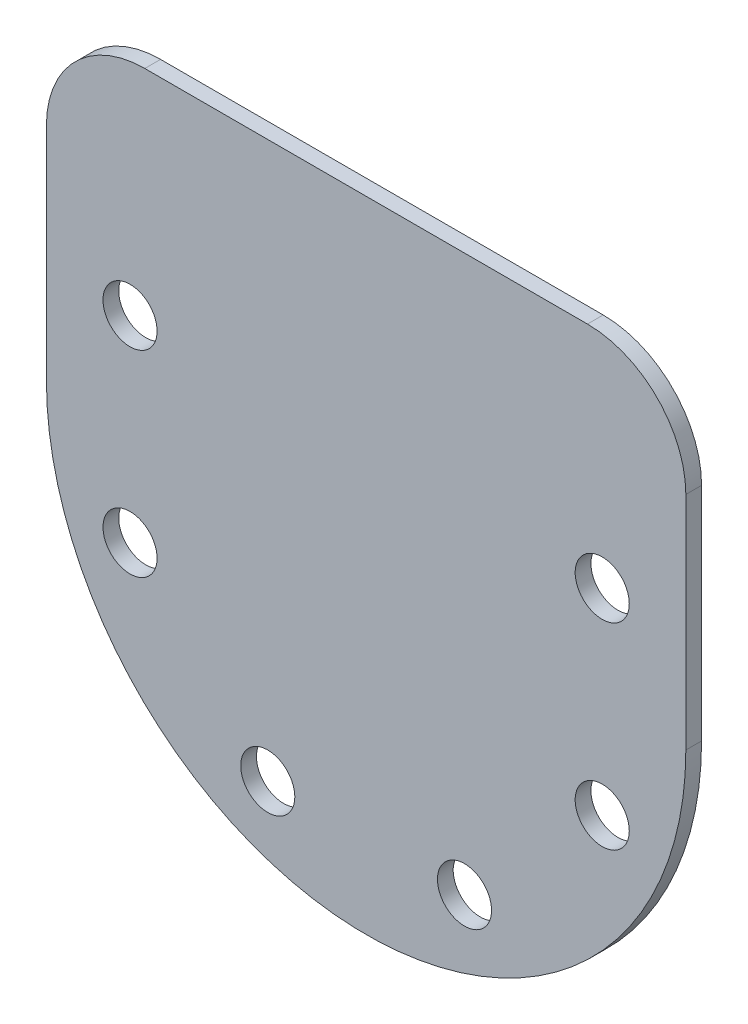
ISO-10303-21;
HEADER;
FILE_DESCRIPTION(('STEP AP214'),'2;1');
FILE_NAME('part.step','',(''),(''),'','','');
FILE_SCHEMA(('AUTOMOTIVE_DESIGN { 1 0 10303 214 1 1 1 1 }'));
ENDSEC;
DATA;
#1=APPLICATION_CONTEXT('core data for automotive mechanical design processes');
#2=APPLICATION_PROTOCOL_DEFINITION('international standard','automotive_design',2000,#1);
#3=PRODUCT_CONTEXT('',#1,'mechanical');
#4=PRODUCT('Part','Part','',(#3));
#5=PRODUCT_RELATED_PRODUCT_CATEGORY('part','',(#4));
#6=PRODUCT_DEFINITION_FORMATION('','',#4);
#7=PRODUCT_DEFINITION_CONTEXT('part definition',#1,'design');
#8=PRODUCT_DEFINITION('design','',#6,#7);
#9=PRODUCT_DEFINITION_SHAPE('','',#8);
#10=(LENGTH_UNIT() NAMED_UNIT(*) SI_UNIT(.MILLI.,.METRE.));
#11=(NAMED_UNIT(*) PLANE_ANGLE_UNIT() SI_UNIT($,.RADIAN.));
#12=(NAMED_UNIT(*) SI_UNIT($,.STERADIAN.) SOLID_ANGLE_UNIT());
#13=UNCERTAINTY_MEASURE_WITH_UNIT(LENGTH_MEASURE(1.E-05),#10,'distance_accuracy_value','');
#14=(GEOMETRIC_REPRESENTATION_CONTEXT(3) GLOBAL_UNCERTAINTY_ASSIGNED_CONTEXT((#13)) GLOBAL_UNIT_ASSIGNED_CONTEXT((#10,
#11,#12)) REPRESENTATION_CONTEXT('',''));
#15=CARTESIAN_POINT('',(0.,0.,0.));
#16=DIRECTION('',(0.,0.,1.));
#17=DIRECTION('',(1.,0.,0.));
#18=AXIS2_PLACEMENT_3D('',#15,#16,#17);
#19=CARTESIAN_POINT('',(32.5,0.,1.6002));
#20=DIRECTION('',(-1.,0.,0.));
#21=DIRECTION('',(0.,0.,1.));
#22=AXIS2_PLACEMENT_3D('',#19,#20,#21);
#23=PLANE('',#22);
#24=DIRECTION('',(0.,1.,0.));
#25=VECTOR('',#24,1.);
#26=CARTESIAN_POINT('',(32.5,0.,0.));
#27=LINE('',#26,#25);
#28=CARTESIAN_POINT('',(32.5,0.,0.));
#29=VERTEX_POINT('',#28);
#30=CARTESIAN_POINT('',(32.5,22.5,0.));
#31=VERTEX_POINT('',#30);
#32=EDGE_CURVE('E115',#29,#31,#27,.T.);
#33=ORIENTED_EDGE('',*,*,#32,.T.);
#34=DIRECTION('',(0.,0.,-1.));
#35=VECTOR('',#34,1.);
#36=CARTESIAN_POINT('',(32.5,22.5,1.6002));
#37=LINE('',#36,#35);
#38=CARTESIAN_POINT('',(32.5,22.5,1.6002));
#39=VERTEX_POINT('',#38);
#40=EDGE_CURVE('E11',#31,#39,#37,.F.);
#41=ORIENTED_EDGE('',*,*,#40,.T.);
#42=DIRECTION('',(0.,1.,0.));
#43=VECTOR('',#42,1.);
#44=CARTESIAN_POINT('',(32.5,0.,1.6002));
#45=LINE('',#44,#43);
#46=CARTESIAN_POINT('',(32.5,0.,1.6002));
#47=VERTEX_POINT('',#46);
#48=EDGE_CURVE('E122',#47,#39,#45,.T.);
#49=ORIENTED_EDGE('',*,*,#48,.F.);
#50=DIRECTION('',(0.,0.,-1.));
#51=VECTOR('',#50,1.);
#52=CARTESIAN_POINT('',(32.5,0.,1.6002));
#53=LINE('',#52,#51);
#54=EDGE_CURVE('E107',#47,#29,#53,.T.);
#55=ORIENTED_EDGE('',*,*,#54,.T.);
#56=EDGE_LOOP('',(#33,#41,#49,#55));
#57=FACE_BOUND('',#56,.T.);
#58=ADVANCED_FACE('F33',(#57),#23,.F.);
#59=CARTESIAN_POINT('',(-32.5,32.5,1.6002));
#60=DIRECTION('',(0.,-1.,0.));
#61=DIRECTION('',(0.,0.,-1.));
#62=AXIS2_PLACEMENT_3D('',#59,#60,#61);
#63=PLANE('',#62);
#64=DIRECTION('',(-1.,0.,0.));
#65=VECTOR('',#64,1.);
#66=CARTESIAN_POINT('',(-32.5,32.5,0.));
#67=LINE('',#66,#65);
#68=CARTESIAN_POINT('',(22.5,32.5,0.));
#69=VERTEX_POINT('',#68);
#70=CARTESIAN_POINT('',(-22.5,32.5,0.));
#71=VERTEX_POINT('',#70);
#72=EDGE_CURVE('E117',#69,#71,#67,.T.);
#73=ORIENTED_EDGE('',*,*,#72,.T.);
#74=DIRECTION('',(0.,0.,-1.));
#75=VECTOR('',#74,1.);
#76=CARTESIAN_POINT('',(-22.5,32.5,1.6002));
#77=LINE('',#76,#75);
#78=CARTESIAN_POINT('',(-22.5,32.5,1.6002));
#79=VERTEX_POINT('',#78);
#80=EDGE_CURVE('E54',#71,#79,#77,.F.);
#81=ORIENTED_EDGE('',*,*,#80,.T.);
#82=DIRECTION('',(-1.,0.,0.));
#83=VECTOR('',#82,1.);
#84=CARTESIAN_POINT('',(-32.5,32.5,1.6002));
#85=LINE('',#84,#83);
#86=CARTESIAN_POINT('',(22.5,32.5,1.6002));
#87=VERTEX_POINT('',#86);
#88=EDGE_CURVE('E97',#87,#79,#85,.T.);
#89=ORIENTED_EDGE('',*,*,#88,.F.);
#90=DIRECTION('',(0.,0.,-1.));
#91=VECTOR('',#90,1.);
#92=CARTESIAN_POINT('',(22.5,32.5,1.6002));
#93=LINE('',#92,#91);
#94=EDGE_CURVE('E129',#87,#69,#93,.T.);
#95=ORIENTED_EDGE('',*,*,#94,.T.);
#96=EDGE_LOOP('',(#73,#81,#89,#95));
#97=FACE_BOUND('',#96,.T.);
#98=ADVANCED_FACE('F137',(#97),#63,.F.);
#99=CARTESIAN_POINT('',(-32.5,0.,1.6002));
#100=DIRECTION('',(1.,0.,0.));
#101=DIRECTION('',(0.,0.,-1.));
#102=AXIS2_PLACEMENT_3D('',#99,#100,#101);
#103=PLANE('',#102);
#104=DIRECTION('',(0.,-1.,0.));
#105=VECTOR('',#104,1.);
#106=CARTESIAN_POINT('',(-32.5,0.,1.6002));
#107=LINE('',#106,#105);
#108=CARTESIAN_POINT('',(-32.5,22.5,1.6002));
#109=VERTEX_POINT('',#108);
#110=CARTESIAN_POINT('',(-32.5,0.,1.6002));
#111=VERTEX_POINT('',#110);
#112=EDGE_CURVE('E87',#109,#111,#107,.T.);
#113=ORIENTED_EDGE('',*,*,#112,.F.);
#114=DIRECTION('',(0.,0.,-1.));
#115=VECTOR('',#114,1.);
#116=CARTESIAN_POINT('',(-32.5,22.5,1.6002));
#117=LINE('',#116,#115);
#118=CARTESIAN_POINT('',(-32.5,22.5,0.));
#119=VERTEX_POINT('',#118);
#120=EDGE_CURVE('E106',#109,#119,#117,.T.);
#121=ORIENTED_EDGE('',*,*,#120,.T.);
#122=DIRECTION('',(0.,-1.,0.));
#123=VECTOR('',#122,1.);
#124=CARTESIAN_POINT('',(-32.5,0.,0.));
#125=LINE('',#124,#123);
#126=CARTESIAN_POINT('',(-32.5,0.,0.));
#127=VERTEX_POINT('',#126);
#128=EDGE_CURVE('E103',#119,#127,#125,.T.);
#129=ORIENTED_EDGE('',*,*,#128,.T.);
#130=DIRECTION('',(0.,0.,-1.));
#131=VECTOR('',#130,1.);
#132=CARTESIAN_POINT('',(-32.5,0.,1.6002));
#133=LINE('',#132,#131);
#134=EDGE_CURVE('E100',#111,#127,#133,.T.);
#135=ORIENTED_EDGE('',*,*,#134,.F.);
#136=EDGE_LOOP('',(#113,#121,#129,#135));
#137=FACE_BOUND('',#136,.T.);
#138=ADVANCED_FACE('F101',(#137),#103,.F.);
#139=CARTESIAN_POINT('',(0.,0.,1.6002));
#140=DIRECTION('',(0.,0.,-1.));
#141=DIRECTION('',(-1.,0.,0.));
#142=AXIS2_PLACEMENT_3D('',#139,#140,#141);
#143=CYLINDRICAL_SURFACE('',#142,32.5);
#144=CARTESIAN_POINT('',(0.,0.,0.));
#145=DIRECTION('',(0.,0.,1.));
#146=DIRECTION('',(1.,0.,0.));
#147=AXIS2_PLACEMENT_3D('',#144,#145,#146);
#148=CIRCLE('',#147,32.5);
#149=EDGE_CURVE('E121',#127,#29,#148,.T.);
#150=ORIENTED_EDGE('',*,*,#149,.T.);
#151=ORIENTED_EDGE('',*,*,#54,.F.);
#152=CARTESIAN_POINT('',(0.,0.,1.6002));
#153=DIRECTION('',(0.,0.,1.));
#154=DIRECTION('',(1.,0.,0.));
#155=AXIS2_PLACEMENT_3D('',#152,#153,#154);
#156=CIRCLE('',#155,32.5);
#157=EDGE_CURVE('E91',#111,#47,#156,.T.);
#158=ORIENTED_EDGE('',*,*,#157,.F.);
#159=ORIENTED_EDGE('',*,*,#134,.T.);
#160=EDGE_LOOP('',(#150,#151,#158,#159));
#161=FACE_BOUND('',#160,.T.);
#162=ADVANCED_FACE('F109',(#161),#143,.T.);
#163=CARTESIAN_POINT('',(0.,0.,1.6002));
#164=DIRECTION('',(0.,0.,1.));
#165=DIRECTION('',(1.,0.,0.));
#166=AXIS2_PLACEMENT_3D('',#163,#164,#165);
#167=PLANE('',#166);
#168=CARTESIAN_POINT('',(10.,-24.,1.6002));
#169=DIRECTION('',(0.,0.,1.));
#170=DIRECTION('',(1.,0.,0.));
#171=AXIS2_PLACEMENT_3D('',#168,#169,#170);
#172=CIRCLE('',#171,2.75);
#173=CARTESIAN_POINT('',(12.75,-24.,1.6002));
#174=VERTEX_POINT('',#173);
#175=EDGE_CURVE('E176',#174,#174,#172,.T.);
#176=ORIENTED_EDGE('',*,*,#175,.F.);
#177=EDGE_LOOP('',(#176));
#178=FACE_BOUND('',#177,.T.);
#179=CARTESIAN_POINT('',(-10.,-24.,1.6002));
#180=DIRECTION('',(0.,0.,1.));
#181=DIRECTION('',(1.,0.,0.));
#182=AXIS2_PLACEMENT_3D('',#179,#180,#181);
#183=CIRCLE('',#182,2.75);
#184=CARTESIAN_POINT('',(-7.25,-24.,1.6002));
#185=VERTEX_POINT('',#184);
#186=EDGE_CURVE('E170',#185,#185,#183,.T.);
#187=ORIENTED_EDGE('',*,*,#186,.F.);
#188=EDGE_LOOP('',(#187));
#189=FACE_BOUND('',#188,.T.);
#190=CARTESIAN_POINT('',(-24.,-10.,1.6002));
#191=DIRECTION('',(0.,0.,1.));
#192=DIRECTION('',(1.,0.,0.));
#193=AXIS2_PLACEMENT_3D('',#190,#191,#192);
#194=CIRCLE('',#193,2.75);
#195=CARTESIAN_POINT('',(-21.25,-10.,1.6002));
#196=VERTEX_POINT('',#195);
#197=EDGE_CURVE('E164',#196,#196,#194,.T.);
#198=ORIENTED_EDGE('',*,*,#197,.F.);
#199=EDGE_LOOP('',(#198));
#200=FACE_BOUND('',#199,.T.);
#201=CARTESIAN_POINT('',(-24.,10.,1.6002));
#202=DIRECTION('',(0.,0.,1.));
#203=DIRECTION('',(1.,0.,0.));
#204=AXIS2_PLACEMENT_3D('',#201,#202,#203);
#205=CIRCLE('',#204,2.75);
#206=CARTESIAN_POINT('',(-21.25,10.,1.6002));
#207=VERTEX_POINT('',#206);
#208=EDGE_CURVE('E158',#207,#207,#205,.T.);
#209=ORIENTED_EDGE('',*,*,#208,.F.);
#210=EDGE_LOOP('',(#209));
#211=FACE_BOUND('',#210,.T.);
#212=CARTESIAN_POINT('',(24.,10.,1.6002));
#213=DIRECTION('',(0.,0.,1.));
#214=DIRECTION('',(1.,0.,0.));
#215=AXIS2_PLACEMENT_3D('',#212,#213,#214);
#216=CIRCLE('',#215,2.75);
#217=CARTESIAN_POINT('',(26.75,10.,1.6002));
#218=VERTEX_POINT('',#217);
#219=EDGE_CURVE('E152',#218,#218,#216,.T.);
#220=ORIENTED_EDGE('',*,*,#219,.F.);
#221=EDGE_LOOP('',(#220));
#222=FACE_BOUND('',#221,.T.);
#223=CARTESIAN_POINT('',(24.,-10.,1.6002));
#224=DIRECTION('',(0.,0.,1.));
#225=DIRECTION('',(1.,0.,0.));
#226=AXIS2_PLACEMENT_3D('',#223,#224,#225);
#227=CIRCLE('',#226,2.75);
#228=CARTESIAN_POINT('',(26.75,-10.,1.6002));
#229=VERTEX_POINT('',#228);
#230=EDGE_CURVE('E146',#229,#229,#227,.T.);
#231=ORIENTED_EDGE('',*,*,#230,.F.);
#232=EDGE_LOOP('',(#231));
#233=FACE_BOUND('',#232,.T.);
#234=ORIENTED_EDGE('',*,*,#88,.T.);
#235=CARTESIAN_POINT('',(-22.5,22.5,1.6002));
#236=DIRECTION('',(0.,0.,1.));
#237=DIRECTION('',(1.,0.,0.));
#238=AXIS2_PLACEMENT_3D('',#235,#236,#237);
#239=CIRCLE('',#238,10.);
#240=EDGE_CURVE('E41',#79,#109,#239,.T.);
#241=ORIENTED_EDGE('',*,*,#240,.T.);
#242=ORIENTED_EDGE('',*,*,#112,.T.);
#243=ORIENTED_EDGE('',*,*,#157,.T.);
#244=ORIENTED_EDGE('',*,*,#48,.T.);
#245=CARTESIAN_POINT('',(22.5,22.5,1.6002));
#246=DIRECTION('',(0.,0.,1.));
#247=DIRECTION('',(1.,0.,0.));
#248=AXIS2_PLACEMENT_3D('',#245,#246,#247);
#249=CIRCLE('',#248,10.);
#250=EDGE_CURVE('E133',#39,#87,#249,.T.);
#251=ORIENTED_EDGE('',*,*,#250,.T.);
#252=EDGE_LOOP('',(#234,#241,#242,#243,#244,#251));
#253=FACE_BOUND('',#252,.T.);
#254=ADVANCED_FACE('F89',(#178,#189,#200,#211,#222,#233,#253),#167,.T.);
#255=CARTESIAN_POINT('',(0.,0.,0.));
#256=DIRECTION('',(0.,0.,1.));
#257=DIRECTION('',(1.,0.,0.));
#258=AXIS2_PLACEMENT_3D('',#255,#256,#257);
#259=PLANE('',#258);
#260=CARTESIAN_POINT('',(10.,-24.,0.));
#261=DIRECTION('',(0.,0.,1.));
#262=DIRECTION('',(1.,0.,0.));
#263=AXIS2_PLACEMENT_3D('',#260,#261,#262);
#264=CIRCLE('',#263,2.75);
#265=CARTESIAN_POINT('',(12.75,-24.,0.));
#266=VERTEX_POINT('',#265);
#267=EDGE_CURVE('E173',#266,#266,#264,.T.);
#268=ORIENTED_EDGE('',*,*,#267,.T.);
#269=EDGE_LOOP('',(#268));
#270=FACE_BOUND('',#269,.T.);
#271=CARTESIAN_POINT('',(-10.,-24.,0.));
#272=DIRECTION('',(0.,0.,1.));
#273=DIRECTION('',(1.,0.,0.));
#274=AXIS2_PLACEMENT_3D('',#271,#272,#273);
#275=CIRCLE('',#274,2.75);
#276=CARTESIAN_POINT('',(-7.25,-24.,0.));
#277=VERTEX_POINT('',#276);
#278=EDGE_CURVE('E167',#277,#277,#275,.T.);
#279=ORIENTED_EDGE('',*,*,#278,.T.);
#280=EDGE_LOOP('',(#279));
#281=FACE_BOUND('',#280,.T.);
#282=CARTESIAN_POINT('',(-24.,-10.,0.));
#283=DIRECTION('',(0.,0.,1.));
#284=DIRECTION('',(1.,0.,0.));
#285=AXIS2_PLACEMENT_3D('',#282,#283,#284);
#286=CIRCLE('',#285,2.75);
#287=CARTESIAN_POINT('',(-21.25,-10.,0.));
#288=VERTEX_POINT('',#287);
#289=EDGE_CURVE('E161',#288,#288,#286,.T.);
#290=ORIENTED_EDGE('',*,*,#289,.T.);
#291=EDGE_LOOP('',(#290));
#292=FACE_BOUND('',#291,.T.);
#293=CARTESIAN_POINT('',(-24.,10.,0.));
#294=DIRECTION('',(0.,0.,1.));
#295=DIRECTION('',(1.,0.,0.));
#296=AXIS2_PLACEMENT_3D('',#293,#294,#295);
#297=CIRCLE('',#296,2.75);
#298=CARTESIAN_POINT('',(-21.25,10.,0.));
#299=VERTEX_POINT('',#298);
#300=EDGE_CURVE('E155',#299,#299,#297,.T.);
#301=ORIENTED_EDGE('',*,*,#300,.T.);
#302=EDGE_LOOP('',(#301));
#303=FACE_BOUND('',#302,.T.);
#304=CARTESIAN_POINT('',(24.,10.,0.));
#305=DIRECTION('',(0.,0.,1.));
#306=DIRECTION('',(1.,0.,0.));
#307=AXIS2_PLACEMENT_3D('',#304,#305,#306);
#308=CIRCLE('',#307,2.75);
#309=CARTESIAN_POINT('',(26.75,10.,0.));
#310=VERTEX_POINT('',#309);
#311=EDGE_CURVE('E149',#310,#310,#308,.T.);
#312=ORIENTED_EDGE('',*,*,#311,.T.);
#313=EDGE_LOOP('',(#312));
#314=FACE_BOUND('',#313,.T.);
#315=CARTESIAN_POINT('',(24.,-10.,0.));
#316=DIRECTION('',(0.,0.,1.));
#317=DIRECTION('',(1.,0.,0.));
#318=AXIS2_PLACEMENT_3D('',#315,#316,#317);
#319=CIRCLE('',#318,2.75);
#320=CARTESIAN_POINT('',(26.75,-10.,0.));
#321=VERTEX_POINT('',#320);
#322=EDGE_CURVE('E118',#321,#321,#319,.T.);
#323=ORIENTED_EDGE('',*,*,#322,.T.);
#324=EDGE_LOOP('',(#323));
#325=FACE_BOUND('',#324,.T.);
#326=ORIENTED_EDGE('',*,*,#128,.F.);
#327=CARTESIAN_POINT('',(-22.5,22.5,0.));
#328=DIRECTION('',(0.,0.,1.));
#329=DIRECTION('',(1.,0.,0.));
#330=AXIS2_PLACEMENT_3D('',#327,#328,#329);
#331=CIRCLE('',#330,10.);
#332=EDGE_CURVE('E127',#119,#71,#331,.F.);
#333=ORIENTED_EDGE('',*,*,#332,.T.);
#334=ORIENTED_EDGE('',*,*,#72,.F.);
#335=CARTESIAN_POINT('',(22.5,22.5,0.));
#336=DIRECTION('',(0.,0.,1.));
#337=DIRECTION('',(1.,0.,0.));
#338=AXIS2_PLACEMENT_3D('',#335,#336,#337);
#339=CIRCLE('',#338,10.);
#340=EDGE_CURVE('E125',#69,#31,#339,.F.);
#341=ORIENTED_EDGE('',*,*,#340,.T.);
#342=ORIENTED_EDGE('',*,*,#32,.F.);
#343=ORIENTED_EDGE('',*,*,#149,.F.);
#344=EDGE_LOOP('',(#326,#333,#334,#341,#342,#343));
#345=FACE_BOUND('',#344,.T.);
#346=ADVANCED_FACE('F141',(#270,#281,#292,#303,#314,#325,#345),#259,.F.);
#347=CARTESIAN_POINT('',(24.,-10.,1.6002));
#348=DIRECTION('',(0.,0.,1.));
#349=DIRECTION('',(1.,0.,0.));
#350=AXIS2_PLACEMENT_3D('',#347,#348,#349);
#351=CYLINDRICAL_SURFACE('',#350,2.75);
#352=ORIENTED_EDGE('',*,*,#322,.F.);
#353=EDGE_LOOP('',(#352));
#354=FACE_BOUND('',#353,.T.);
#355=ORIENTED_EDGE('',*,*,#230,.T.);
#356=EDGE_LOOP('',(#355));
#357=FACE_BOUND('',#356,.T.);
#358=ADVANCED_FACE('F195',(#354,#357),#351,.F.);
#359=CARTESIAN_POINT('',(24.,10.,1.6002));
#360=DIRECTION('',(0.,0.,1.));
#361=DIRECTION('',(1.,0.,0.));
#362=AXIS2_PLACEMENT_3D('',#359,#360,#361);
#363=CYLINDRICAL_SURFACE('',#362,2.75);
#364=ORIENTED_EDGE('',*,*,#311,.F.);
#365=EDGE_LOOP('',(#364));
#366=FACE_BOUND('',#365,.T.);
#367=ORIENTED_EDGE('',*,*,#219,.T.);
#368=EDGE_LOOP('',(#367));
#369=FACE_BOUND('',#368,.T.);
#370=ADVANCED_FACE('F197',(#366,#369),#363,.F.);
#371=CARTESIAN_POINT('',(-24.,10.,1.6002));
#372=DIRECTION('',(0.,0.,1.));
#373=DIRECTION('',(1.,0.,0.));
#374=AXIS2_PLACEMENT_3D('',#371,#372,#373);
#375=CYLINDRICAL_SURFACE('',#374,2.75);
#376=ORIENTED_EDGE('',*,*,#300,.F.);
#377=EDGE_LOOP('',(#376));
#378=FACE_BOUND('',#377,.T.);
#379=ORIENTED_EDGE('',*,*,#208,.T.);
#380=EDGE_LOOP('',(#379));
#381=FACE_BOUND('',#380,.T.);
#382=ADVANCED_FACE('F204',(#378,#381),#375,.F.);
#383=CARTESIAN_POINT('',(-24.,-10.,1.6002));
#384=DIRECTION('',(0.,0.,1.));
#385=DIRECTION('',(1.,0.,0.));
#386=AXIS2_PLACEMENT_3D('',#383,#384,#385);
#387=CYLINDRICAL_SURFACE('',#386,2.75);
#388=ORIENTED_EDGE('',*,*,#289,.F.);
#389=EDGE_LOOP('',(#388));
#390=FACE_BOUND('',#389,.T.);
#391=ORIENTED_EDGE('',*,*,#197,.T.);
#392=EDGE_LOOP('',(#391));
#393=FACE_BOUND('',#392,.T.);
#394=ADVANCED_FACE('F230',(#390,#393),#387,.F.);
#395=CARTESIAN_POINT('',(-10.,-24.,1.6002));
#396=DIRECTION('',(0.,0.,1.));
#397=DIRECTION('',(1.,0.,0.));
#398=AXIS2_PLACEMENT_3D('',#395,#396,#397);
#399=CYLINDRICAL_SURFACE('',#398,2.75);
#400=ORIENTED_EDGE('',*,*,#278,.F.);
#401=EDGE_LOOP('',(#400));
#402=FACE_BOUND('',#401,.T.);
#403=ORIENTED_EDGE('',*,*,#186,.T.);
#404=EDGE_LOOP('',(#403));
#405=FACE_BOUND('',#404,.T.);
#406=ADVANCED_FACE('F224',(#402,#405),#399,.F.);
#407=CARTESIAN_POINT('',(10.,-24.,1.6002));
#408=DIRECTION('',(0.,0.,1.));
#409=DIRECTION('',(1.,0.,0.));
#410=AXIS2_PLACEMENT_3D('',#407,#408,#409);
#411=CYLINDRICAL_SURFACE('',#410,2.75);
#412=ORIENTED_EDGE('',*,*,#267,.F.);
#413=EDGE_LOOP('',(#412));
#414=FACE_BOUND('',#413,.T.);
#415=ORIENTED_EDGE('',*,*,#175,.T.);
#416=EDGE_LOOP('',(#415));
#417=FACE_BOUND('',#416,.T.);
#418=ADVANCED_FACE('F180',(#414,#417),#411,.F.);
#419=CARTESIAN_POINT('',(-22.5,22.5,1.6002));
#420=DIRECTION('',(0.,0.,-1.));
#421=DIRECTION('',(-1.,0.,0.));
#422=AXIS2_PLACEMENT_3D('',#419,#420,#421);
#423=CYLINDRICAL_SURFACE('',#422,10.);
#424=ORIENTED_EDGE('',*,*,#240,.F.);
#425=ORIENTED_EDGE('',*,*,#80,.F.);
#426=ORIENTED_EDGE('',*,*,#332,.F.);
#427=ORIENTED_EDGE('',*,*,#120,.F.);
#428=EDGE_LOOP('',(#424,#425,#426,#427));
#429=FACE_BOUND('',#428,.T.);
#430=ADVANCED_FACE('F217',(#429),#423,.T.);
#431=CARTESIAN_POINT('',(22.5,22.5,1.6002));
#432=DIRECTION('',(0.,0.,-1.));
#433=DIRECTION('',(-1.,0.,0.));
#434=AXIS2_PLACEMENT_3D('',#431,#432,#433);
#435=CYLINDRICAL_SURFACE('',#434,10.);
#436=ORIENTED_EDGE('',*,*,#250,.F.);
#437=ORIENTED_EDGE('',*,*,#40,.F.);
#438=ORIENTED_EDGE('',*,*,#340,.F.);
#439=ORIENTED_EDGE('',*,*,#94,.F.);
#440=EDGE_LOOP('',(#436,#437,#438,#439));
#441=FACE_BOUND('',#440,.T.);
#442=ADVANCED_FACE('F35',(#441),#435,.T.);
#443=CLOSED_SHELL('',(#58,#98,#138,#162,#254,#346,#358,#370,#382,#394,#406,#418,#430,#442));
#444=MANIFOLD_SOLID_BREP('B2',#443);
#445=ADVANCED_BREP_SHAPE_REPRESENTATION('',(#18,#444),#14);
#446=SHAPE_DEFINITION_REPRESENTATION(#9,#445);
ENDSEC;
END-ISO-10303-21;
